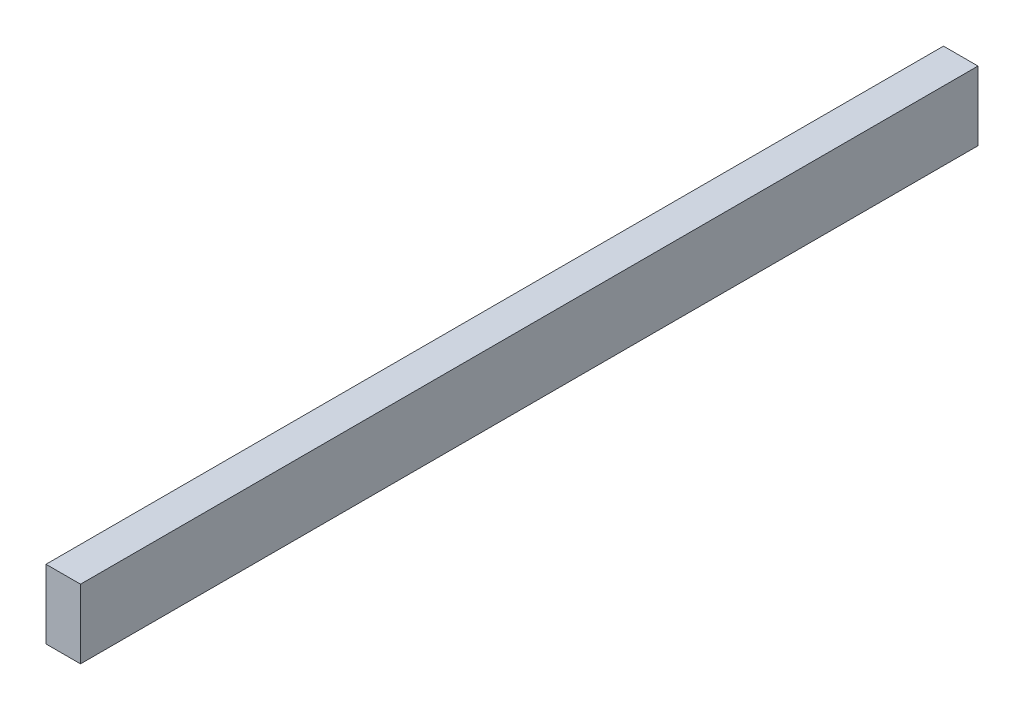
ISO-10303-21;
HEADER;
FILE_DESCRIPTION(('STEP AP214'),'2;1');
FILE_NAME('part.step','',(''),(''),'','','');
FILE_SCHEMA(('AUTOMOTIVE_DESIGN { 1 0 10303 214 1 1 1 1 }'));
ENDSEC;
DATA;
#1=APPLICATION_CONTEXT('core data for automotive mechanical design processes');
#2=APPLICATION_PROTOCOL_DEFINITION('international standard','automotive_design',2000,#1);
#3=PRODUCT_CONTEXT('',#1,'mechanical');
#4=PRODUCT('Part','Part','',(#3));
#5=PRODUCT_RELATED_PRODUCT_CATEGORY('part','',(#4));
#6=PRODUCT_DEFINITION_FORMATION('','',#4);
#7=PRODUCT_DEFINITION_CONTEXT('part definition',#1,'design');
#8=PRODUCT_DEFINITION('design','',#6,#7);
#9=PRODUCT_DEFINITION_SHAPE('','',#8);
#10=(LENGTH_UNIT() NAMED_UNIT(*) SI_UNIT(.MILLI.,.METRE.));
#11=(NAMED_UNIT(*) PLANE_ANGLE_UNIT() SI_UNIT($,.RADIAN.));
#12=(NAMED_UNIT(*) SI_UNIT($,.STERADIAN.) SOLID_ANGLE_UNIT());
#13=UNCERTAINTY_MEASURE_WITH_UNIT(LENGTH_MEASURE(1.E-05),#10,'distance_accuracy_value','');
#14=(GEOMETRIC_REPRESENTATION_CONTEXT(3) GLOBAL_UNCERTAINTY_ASSIGNED_CONTEXT((#13)) GLOBAL_UNIT_ASSIGNED_CONTEXT((#10,
#11,#12)) REPRESENTATION_CONTEXT('',''));
#15=CARTESIAN_POINT('',(0.,0.,0.));
#16=DIRECTION('',(0.,0.,1.));
#17=DIRECTION('',(1.,0.,0.));
#18=AXIS2_PLACEMENT_3D('',#15,#16,#17);
#19=CARTESIAN_POINT('',(0.,50.8,0.));
#20=DIRECTION('',(1.,0.,0.));
#21=DIRECTION('',(0.,0.,-1.));
#22=AXIS2_PLACEMENT_3D('',#19,#20,#21);
#23=PLANE('',#22);
#24=DIRECTION('',(0.,0.,1.));
#25=VECTOR('',#24,1.);
#26=CARTESIAN_POINT('',(0.,0.,0.));
#27=LINE('',#26,#25);
#28=CARTESIAN_POINT('',(0.,0.,-660.4));
#29=VERTEX_POINT('',#28);
#30=CARTESIAN_POINT('',(0.,0.,0.));
#31=VERTEX_POINT('',#30);
#32=EDGE_CURVE('E96',#29,#31,#27,.T.);
#33=ORIENTED_EDGE('',*,*,#32,.T.);
#34=DIRECTION('',(0.,-1.,0.));
#35=VECTOR('',#34,1.);
#36=CARTESIAN_POINT('',(0.,50.8,0.));
#37=LINE('',#36,#35);
#38=CARTESIAN_POINT('',(0.,50.8,0.));
#39=VERTEX_POINT('',#38);
#40=EDGE_CURVE('E11',#39,#31,#37,.T.);
#41=ORIENTED_EDGE('',*,*,#40,.F.);
#42=DIRECTION('',(0.,0.,1.));
#43=VECTOR('',#42,1.);
#44=CARTESIAN_POINT('',(0.,50.8,0.));
#45=LINE('',#44,#43);
#46=CARTESIAN_POINT('',(0.,50.8,-660.4));
#47=VERTEX_POINT('',#46);
#48=EDGE_CURVE('E84',#47,#39,#45,.T.);
#49=ORIENTED_EDGE('',*,*,#48,.F.);
#50=DIRECTION('',(0.,-1.,0.));
#51=VECTOR('',#50,1.);
#52=CARTESIAN_POINT('',(0.,50.8,-660.4));
#53=LINE('',#52,#51);
#54=EDGE_CURVE('E92',#47,#29,#53,.T.);
#55=ORIENTED_EDGE('',*,*,#54,.T.);
#56=EDGE_LOOP('',(#33,#41,#49,#55));
#57=FACE_BOUND('',#56,.T.);
#58=ADVANCED_FACE('F33',(#57),#23,.F.);
#59=CARTESIAN_POINT('',(0.,50.8,0.));
#60=DIRECTION('',(0.,0.,-1.));
#61=DIRECTION('',(-1.,0.,0.));
#62=AXIS2_PLACEMENT_3D('',#59,#60,#61);
#63=PLANE('',#62);
#64=DIRECTION('',(1.,0.,0.));
#65=VECTOR('',#64,1.);
#66=CARTESIAN_POINT('',(0.,0.,0.));
#67=LINE('',#66,#65);
#68=CARTESIAN_POINT('',(25.4,0.,0.));
#69=VERTEX_POINT('',#68);
#70=EDGE_CURVE('E88',#31,#69,#67,.T.);
#71=ORIENTED_EDGE('',*,*,#70,.T.);
#72=DIRECTION('',(0.,-1.,0.));
#73=VECTOR('',#72,1.);
#74=CARTESIAN_POINT('',(25.4,50.8,0.));
#75=LINE('',#74,#73);
#76=CARTESIAN_POINT('',(25.4,50.8,0.));
#77=VERTEX_POINT('',#76);
#78=EDGE_CURVE('E41',#77,#69,#75,.T.);
#79=ORIENTED_EDGE('',*,*,#78,.F.);
#80=DIRECTION('',(1.,0.,0.));
#81=VECTOR('',#80,1.);
#82=CARTESIAN_POINT('',(0.,50.8,0.));
#83=LINE('',#82,#81);
#84=EDGE_CURVE('E79',#39,#77,#83,.T.);
#85=ORIENTED_EDGE('',*,*,#84,.F.);
#86=ORIENTED_EDGE('',*,*,#40,.T.);
#87=EDGE_LOOP('',(#71,#79,#85,#86));
#88=FACE_BOUND('',#87,.T.);
#89=ADVANCED_FACE('F87',(#88),#63,.F.);
#90=CARTESIAN_POINT('',(25.4,50.8,0.));
#91=DIRECTION('',(-1.,0.,0.));
#92=DIRECTION('',(0.,0.,1.));
#93=AXIS2_PLACEMENT_3D('',#90,#91,#92);
#94=PLANE('',#93);
#95=DIRECTION('',(0.,0.,-1.));
#96=VECTOR('',#95,1.);
#97=CARTESIAN_POINT('',(25.4,0.,0.));
#98=LINE('',#97,#96);
#99=CARTESIAN_POINT('',(25.4,0.,-660.4));
#100=VERTEX_POINT('',#99);
#101=EDGE_CURVE('E66',#69,#100,#98,.T.);
#102=ORIENTED_EDGE('',*,*,#101,.T.);
#103=DIRECTION('',(0.,-1.,0.));
#104=VECTOR('',#103,1.);
#105=CARTESIAN_POINT('',(25.4,50.8,-660.4));
#106=LINE('',#105,#104);
#107=CARTESIAN_POINT('',(25.4,50.8,-660.4));
#108=VERTEX_POINT('',#107);
#109=EDGE_CURVE('E89',#108,#100,#106,.T.);
#110=ORIENTED_EDGE('',*,*,#109,.F.);
#111=DIRECTION('',(0.,0.,-1.));
#112=VECTOR('',#111,1.);
#113=CARTESIAN_POINT('',(25.4,50.8,0.));
#114=LINE('',#113,#112);
#115=EDGE_CURVE('E82',#77,#108,#114,.T.);
#116=ORIENTED_EDGE('',*,*,#115,.F.);
#117=ORIENTED_EDGE('',*,*,#78,.T.);
#118=EDGE_LOOP('',(#102,#110,#116,#117));
#119=FACE_BOUND('',#118,.T.);
#120=ADVANCED_FACE('F90',(#119),#94,.F.);
#121=CARTESIAN_POINT('',(0.,50.8,-660.4));
#122=DIRECTION('',(0.,0.,1.));
#123=DIRECTION('',(1.,0.,0.));
#124=AXIS2_PLACEMENT_3D('',#121,#122,#123);
#125=PLANE('',#124);
#126=DIRECTION('',(-1.,0.,0.));
#127=VECTOR('',#126,1.);
#128=CARTESIAN_POINT('',(0.,0.,-660.4));
#129=LINE('',#128,#127);
#130=EDGE_CURVE('E72',#100,#29,#129,.T.);
#131=ORIENTED_EDGE('',*,*,#130,.T.);
#132=ORIENTED_EDGE('',*,*,#54,.F.);
#133=DIRECTION('',(-1.,0.,0.));
#134=VECTOR('',#133,1.);
#135=CARTESIAN_POINT('',(0.,50.8,-660.4));
#136=LINE('',#135,#134);
#137=EDGE_CURVE('E49',#108,#47,#136,.T.);
#138=ORIENTED_EDGE('',*,*,#137,.F.);
#139=ORIENTED_EDGE('',*,*,#109,.T.);
#140=EDGE_LOOP('',(#131,#132,#138,#139));
#141=FACE_BOUND('',#140,.T.);
#142=ADVANCED_FACE('F103',(#141),#125,.F.);
#143=CARTESIAN_POINT('',(0.,50.8,0.));
#144=DIRECTION('',(0.,-1.,0.));
#145=DIRECTION('',(0.,0.,-1.));
#146=AXIS2_PLACEMENT_3D('',#143,#144,#145);
#147=PLANE('',#146);
#148=ORIENTED_EDGE('',*,*,#48,.T.);
#149=ORIENTED_EDGE('',*,*,#84,.T.);
#150=ORIENTED_EDGE('',*,*,#115,.T.);
#151=ORIENTED_EDGE('',*,*,#137,.T.);
#152=EDGE_LOOP('',(#148,#149,#150,#151));
#153=FACE_BOUND('',#152,.T.);
#154=ADVANCED_FACE('F80',(#153),#147,.F.);
#155=CARTESIAN_POINT('',(0.,0.,0.));
#156=DIRECTION('',(0.,-1.,0.));
#157=DIRECTION('',(0.,0.,-1.));
#158=AXIS2_PLACEMENT_3D('',#155,#156,#157);
#159=PLANE('',#158);
#160=ORIENTED_EDGE('',*,*,#32,.F.);
#161=ORIENTED_EDGE('',*,*,#130,.F.);
#162=ORIENTED_EDGE('',*,*,#101,.F.);
#163=ORIENTED_EDGE('',*,*,#70,.F.);
#164=EDGE_LOOP('',(#160,#161,#162,#163));
#165=FACE_BOUND('',#164,.T.);
#166=ADVANCED_FACE('F106',(#165),#159,.T.);
#167=CLOSED_SHELL('',(#58,#89,#120,#142,#154,#166));
#168=MANIFOLD_SOLID_BREP('B2',#167);
#169=ADVANCED_BREP_SHAPE_REPRESENTATION('',(#18,#168),#14);
#170=SHAPE_DEFINITION_REPRESENTATION(#9,#169);
ENDSEC;
END-ISO-10303-21;
